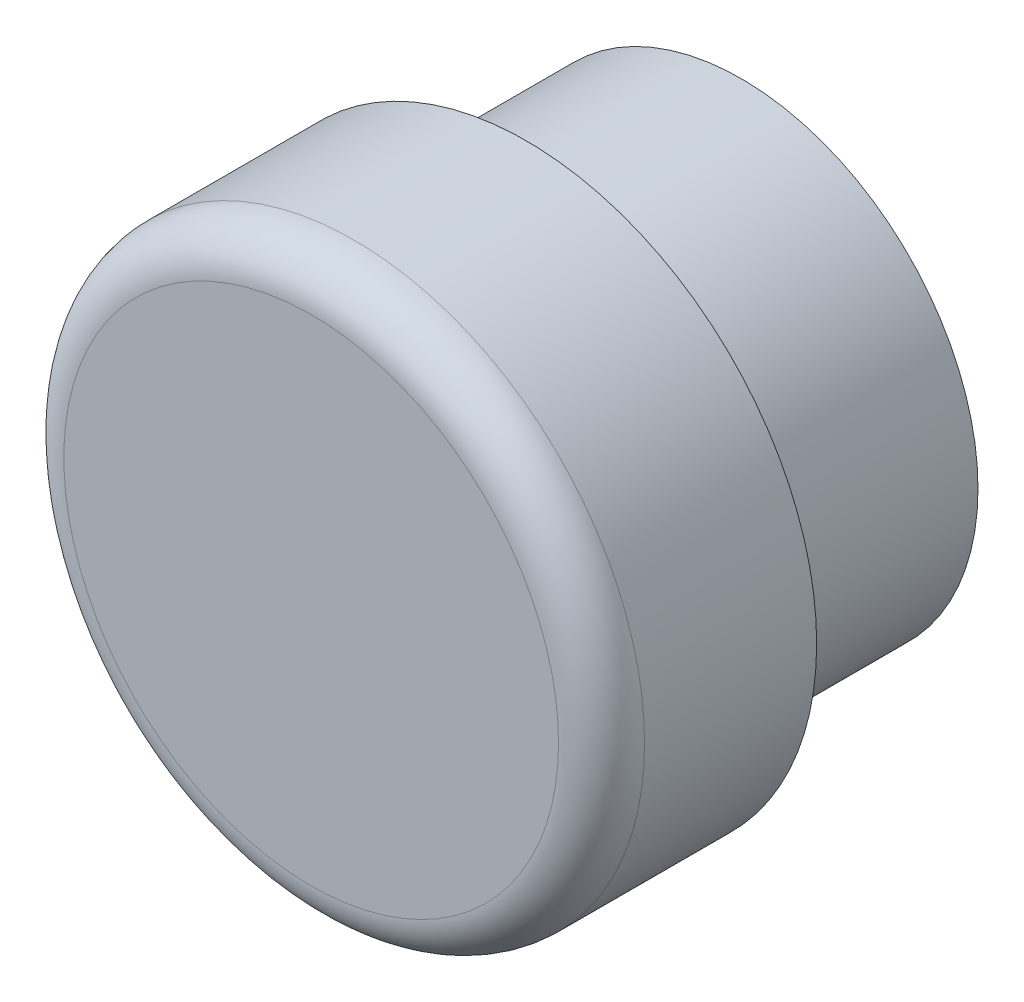
ISO-10303-21;
HEADER;
FILE_DESCRIPTION(('STEP AP214'),'2;1');
FILE_NAME('part.step','',(''),(''),'','','');
FILE_SCHEMA(('AUTOMOTIVE_DESIGN { 1 0 10303 214 1 1 1 1 }'));
ENDSEC;
DATA;
#1=APPLICATION_CONTEXT('core data for automotive mechanical design processes');
#2=APPLICATION_PROTOCOL_DEFINITION('international standard','automotive_design',2000,#1);
#3=PRODUCT_CONTEXT('',#1,'mechanical');
#4=PRODUCT('Part','Part','',(#3));
#5=PRODUCT_RELATED_PRODUCT_CATEGORY('part','',(#4));
#6=PRODUCT_DEFINITION_FORMATION('','',#4);
#7=PRODUCT_DEFINITION_CONTEXT('part definition',#1,'design');
#8=PRODUCT_DEFINITION('design','',#6,#7);
#9=PRODUCT_DEFINITION_SHAPE('','',#8);
#10=(LENGTH_UNIT() NAMED_UNIT(*) SI_UNIT(.MILLI.,.METRE.));
#11=(NAMED_UNIT(*) PLANE_ANGLE_UNIT() SI_UNIT($,.RADIAN.));
#12=(NAMED_UNIT(*) SI_UNIT($,.STERADIAN.) SOLID_ANGLE_UNIT());
#13=UNCERTAINTY_MEASURE_WITH_UNIT(LENGTH_MEASURE(1.E-05),#10,'distance_accuracy_value','');
#14=(GEOMETRIC_REPRESENTATION_CONTEXT(3) GLOBAL_UNCERTAINTY_ASSIGNED_CONTEXT((#13)) GLOBAL_UNIT_ASSIGNED_CONTEXT((#10,
#11,#12)) REPRESENTATION_CONTEXT('',''));
#15=CARTESIAN_POINT('',(0.,0.,0.));
#16=DIRECTION('',(0.,0.,1.));
#17=DIRECTION('',(1.,0.,0.));
#18=AXIS2_PLACEMENT_3D('',#15,#16,#17);
#19=CARTESIAN_POINT('',(0.,0.,10.));
#20=DIRECTION('',(0.,0.,-1.));
#21=DIRECTION('',(-1.,0.,0.));
#22=AXIS2_PLACEMENT_3D('',#19,#20,#21);
#23=CYLINDRICAL_SURFACE('',#22,11.);
#24=CARTESIAN_POINT('',(0.,0.,10.));
#25=DIRECTION('',(0.,0.,1.));
#26=DIRECTION('',(1.,0.,0.));
#27=AXIS2_PLACEMENT_3D('',#24,#25,#26);
#28=CIRCLE('',#27,11.);
#29=CARTESIAN_POINT('',(11.,0.,10.));
#30=VERTEX_POINT('',#29);
#31=EDGE_CURVE('E42',#30,#30,#28,.T.);
#32=ORIENTED_EDGE('',*,*,#31,.F.);
#33=EDGE_LOOP('',(#32));
#34=FACE_BOUND('',#33,.T.);
#35=CARTESIAN_POINT('',(0.,0.,0.));
#36=DIRECTION('',(0.,0.,1.));
#37=DIRECTION('',(1.,0.,0.));
#38=AXIS2_PLACEMENT_3D('',#35,#36,#37);
#39=CIRCLE('',#38,11.);
#40=CARTESIAN_POINT('',(11.,0.,0.));
#41=VERTEX_POINT('',#40);
#42=EDGE_CURVE('E46',#41,#41,#39,.T.);
#43=ORIENTED_EDGE('',*,*,#42,.T.);
#44=EDGE_LOOP('',(#43));
#45=FACE_BOUND('',#44,.T.);
#46=ADVANCED_FACE('F31',(#34,#45),#23,.T.);
#47=CARTESIAN_POINT('',(0.,0.,0.));
#48=DIRECTION('',(0.,0.,1.));
#49=DIRECTION('',(1.,0.,0.));
#50=AXIS2_PLACEMENT_3D('',#47,#48,#49);
#51=PLANE('',#50);
#52=ORIENTED_EDGE('',*,*,#42,.F.);
#53=EDGE_LOOP('',(#52));
#54=FACE_BOUND('',#53,.T.);
#55=ADVANCED_FACE('F70',(#54),#51,.F.);
#56=CARTESIAN_POINT('',(0.,0.,20.));
#57=DIRECTION('',(0.,0.,-1.));
#58=DIRECTION('',(-1.,0.,0.));
#59=AXIS2_PLACEMENT_3D('',#56,#57,#58);
#60=CYLINDRICAL_SURFACE('',#59,13.5);
#61=CARTESIAN_POINT('',(0.,0.,18.));
#62=DIRECTION('',(0.,0.,1.));
#63=DIRECTION('',(1.,0.,0.));
#64=AXIS2_PLACEMENT_3D('',#61,#62,#63);
#65=CIRCLE('',#64,13.5);
#66=CARTESIAN_POINT('',(13.5,0.,18.));
#67=VERTEX_POINT('',#66);
#68=EDGE_CURVE('E10',#67,#67,#65,.F.);
#69=ORIENTED_EDGE('',*,*,#68,.T.);
#70=EDGE_LOOP('',(#69));
#71=FACE_BOUND('',#70,.T.);
#72=CARTESIAN_POINT('',(0.,0.,10.));
#73=DIRECTION('',(0.,0.,1.));
#74=DIRECTION('',(1.,0.,0.));
#75=AXIS2_PLACEMENT_3D('',#72,#73,#74);
#76=CIRCLE('',#75,13.5);
#77=CARTESIAN_POINT('',(13.5,0.,10.));
#78=VERTEX_POINT('',#77);
#79=EDGE_CURVE('E50',#78,#78,#76,.T.);
#80=ORIENTED_EDGE('',*,*,#79,.T.);
#81=EDGE_LOOP('',(#80));
#82=FACE_BOUND('',#81,.T.);
#83=ADVANCED_FACE('F55',(#71,#82),#60,.T.);
#84=CARTESIAN_POINT('',(0.,0.,20.));
#85=DIRECTION('',(0.,0.,1.));
#86=DIRECTION('',(1.,0.,0.));
#87=AXIS2_PLACEMENT_3D('',#84,#85,#86);
#88=PLANE('',#87);
#89=CARTESIAN_POINT('',(0.,0.,20.));
#90=DIRECTION('',(0.,0.,1.));
#91=DIRECTION('',(1.,0.,0.));
#92=AXIS2_PLACEMENT_3D('',#89,#90,#91);
#93=CIRCLE('',#92,11.5);
#94=CARTESIAN_POINT('',(11.5,0.,20.));
#95=VERTEX_POINT('',#94);
#96=EDGE_CURVE('E38',#95,#95,#93,.T.);
#97=ORIENTED_EDGE('',*,*,#96,.T.);
#98=EDGE_LOOP('',(#97));
#99=FACE_BOUND('',#98,.T.);
#100=ADVANCED_FACE('F59',(#99),#88,.T.);
#101=CARTESIAN_POINT('',(0.,0.,10.));
#102=DIRECTION('',(0.,0.,1.));
#103=DIRECTION('',(1.,0.,0.));
#104=AXIS2_PLACEMENT_3D('',#101,#102,#103);
#105=PLANE('',#104);
#106=ORIENTED_EDGE('',*,*,#31,.T.);
#107=EDGE_LOOP('',(#106));
#108=FACE_BOUND('',#107,.T.);
#109=ORIENTED_EDGE('',*,*,#79,.F.);
#110=EDGE_LOOP('',(#109));
#111=FACE_BOUND('',#110,.T.);
#112=ADVANCED_FACE('F57',(#108,#111),#105,.F.);
#113=CARTESIAN_POINT('',(0.,0.,18.));
#114=DIRECTION('',(0.,0.,1.));
#115=DIRECTION('',(1.,0.,0.));
#116=AXIS2_PLACEMENT_3D('',#113,#114,#115);
#117=TOROIDAL_SURFACE('',#116,11.5,2.);
#118=ORIENTED_EDGE('',*,*,#68,.F.);
#119=EDGE_LOOP('',(#118));
#120=FACE_BOUND('',#119,.T.);
#121=ORIENTED_EDGE('',*,*,#96,.F.);
#122=EDGE_LOOP('',(#121));
#123=FACE_BOUND('',#122,.T.);
#124=ADVANCED_FACE('F33',(#120,#123),#117,.T.);
#125=CLOSED_SHELL('',(#46,#55,#83,#100,#112,#124));
#126=MANIFOLD_SOLID_BREP('B2',#125);
#127=ADVANCED_BREP_SHAPE_REPRESENTATION('',(#18,#126),#14);
#128=SHAPE_DEFINITION_REPRESENTATION(#9,#127);
ENDSEC;
END-ISO-10303-21;
